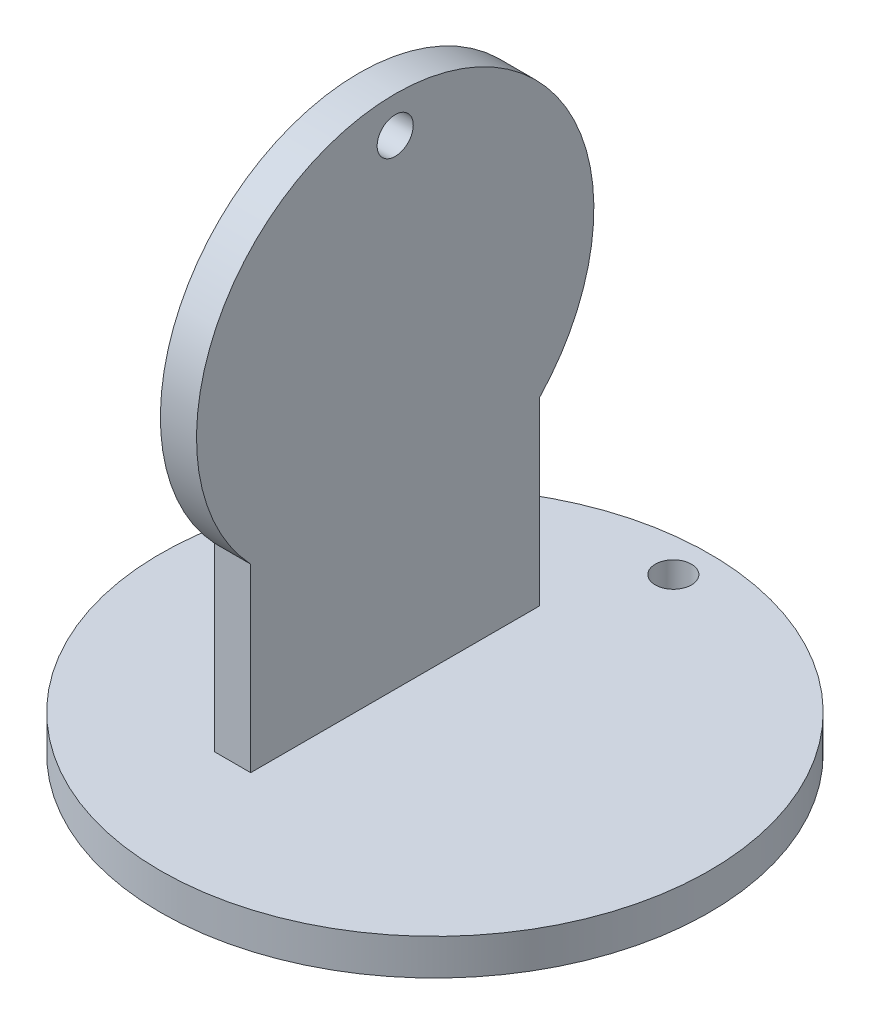
ISO-10303-21;
HEADER;
FILE_DESCRIPTION(('STEP AP214'),'2;1');
FILE_NAME('part.step','',(''),(''),'','','');
FILE_SCHEMA(('AUTOMOTIVE_DESIGN { 1 0 10303 214 1 1 1 1 }'));
ENDSEC;
DATA;
#1=APPLICATION_CONTEXT('core data for automotive mechanical design processes');
#2=APPLICATION_PROTOCOL_DEFINITION('international standard','automotive_design',2000,#1);
#3=PRODUCT_CONTEXT('',#1,'mechanical');
#4=PRODUCT('Part','Part','',(#3));
#5=PRODUCT_RELATED_PRODUCT_CATEGORY('part','',(#4));
#6=PRODUCT_DEFINITION_FORMATION('','',#4);
#7=PRODUCT_DEFINITION_CONTEXT('part definition',#1,'design');
#8=PRODUCT_DEFINITION('design','',#6,#7);
#9=PRODUCT_DEFINITION_SHAPE('','',#8);
#10=(LENGTH_UNIT() NAMED_UNIT(*) SI_UNIT(.MILLI.,.METRE.));
#11=(NAMED_UNIT(*) PLANE_ANGLE_UNIT() SI_UNIT($,.RADIAN.));
#12=(NAMED_UNIT(*) SI_UNIT($,.STERADIAN.) SOLID_ANGLE_UNIT());
#13=UNCERTAINTY_MEASURE_WITH_UNIT(LENGTH_MEASURE(1.E-05),#10,'distance_accuracy_value','');
#14=(GEOMETRIC_REPRESENTATION_CONTEXT(3) GLOBAL_UNCERTAINTY_ASSIGNED_CONTEXT((#13)) GLOBAL_UNIT_ASSIGNED_CONTEXT((#10,
#11,#12)) REPRESENTATION_CONTEXT('',''));
#15=CARTESIAN_POINT('',(0.,0.,0.));
#16=DIRECTION('',(0.,0.,1.));
#17=DIRECTION('',(1.,0.,0.));
#18=AXIS2_PLACEMENT_3D('',#15,#16,#17);
#19=CARTESIAN_POINT('',(0.,5.,0.));
#20=DIRECTION('',(0.,1.,0.));
#21=DIRECTION('',(0.,0.,1.));
#22=AXIS2_PLACEMENT_3D('',#19,#20,#21);
#23=PLANE('',#22);
#24=CARTESIAN_POINT('',(0.,5.,0.));
#25=DIRECTION('',(0.,1.,0.));
#26=DIRECTION('',(0.,0.,1.));
#27=AXIS2_PLACEMENT_3D('',#24,#25,#26);
#28=CIRCLE('',#27,38.);
#29=CARTESIAN_POINT('',(0.,5.,38.));
#30=VERTEX_POINT('',#29);
#31=EDGE_CURVE('E11',#30,#30,#28,.T.);
#32=ORIENTED_EDGE('',*,*,#31,.T.);
#33=EDGE_LOOP('',(#32));
#34=FACE_BOUND('',#33,.T.);
#35=CARTESIAN_POINT('',(0.,5.,-33.));
#36=DIRECTION('',(0.,1.,0.));
#37=DIRECTION('',(0.,0.,1.));
#38=AXIS2_PLACEMENT_3D('',#35,#36,#37);
#39=CIRCLE('',#38,2.5);
#40=CARTESIAN_POINT('',(0.,5.,-30.5));
#41=VERTEX_POINT('',#40);
#42=EDGE_CURVE('E120',#41,#41,#39,.T.);
#43=ORIENTED_EDGE('',*,*,#42,.F.);
#44=EDGE_LOOP('',(#43));
#45=FACE_BOUND('',#44,.T.);
#46=DIRECTION('',(0.,0.,-1.));
#47=VECTOR('',#46,1.);
#48=CARTESIAN_POINT('',(-10.5,4.99999999999999,20.));
#49=LINE('',#48,#47);
#50=CARTESIAN_POINT('',(-10.5,5.,20.));
#51=VERTEX_POINT('',#50);
#52=CARTESIAN_POINT('',(-10.5,4.99999999999999,-20.));
#53=VERTEX_POINT('',#52);
#54=EDGE_CURVE('E53',#51,#53,#49,.T.);
#55=ORIENTED_EDGE('',*,*,#54,.T.);
#56=DIRECTION('',(-1.,0.,0.));
#57=VECTOR('',#56,1.);
#58=CARTESIAN_POINT('',(-5.5,4.99999999999999,-20.));
#59=LINE('',#58,#57);
#60=CARTESIAN_POINT('',(-5.5,4.99999999999999,-20.));
#61=VERTEX_POINT('',#60);
#62=EDGE_CURVE('E79',#61,#53,#59,.T.);
#63=ORIENTED_EDGE('',*,*,#62,.F.);
#64=DIRECTION('',(0.,0.,-1.));
#65=VECTOR('',#64,1.);
#66=CARTESIAN_POINT('',(-5.5,4.99999999999999,20.));
#67=LINE('',#66,#65);
#68=CARTESIAN_POINT('',(-5.5,4.99999999999999,20.));
#69=VERTEX_POINT('',#68);
#70=EDGE_CURVE('E62',#69,#61,#67,.T.);
#71=ORIENTED_EDGE('',*,*,#70,.F.);
#72=DIRECTION('',(-1.,0.,0.));
#73=VECTOR('',#72,1.);
#74=CARTESIAN_POINT('',(-5.5,4.99999999999999,20.));
#75=LINE('',#74,#73);
#76=EDGE_CURVE('E101',#69,#51,#75,.T.);
#77=ORIENTED_EDGE('',*,*,#76,.T.);
#78=EDGE_LOOP('',(#55,#63,#71,#77));
#79=FACE_BOUND('',#78,.T.);
#80=ADVANCED_FACE('F38',(#34,#45,#79),#23,.T.);
#81=CARTESIAN_POINT('',(0.,0.,0.));
#82=DIRECTION('',(0.,1.,0.));
#83=DIRECTION('',(0.,0.,1.));
#84=AXIS2_PLACEMENT_3D('',#81,#82,#83);
#85=PLANE('',#84);
#86=CARTESIAN_POINT('',(0.,0.,0.));
#87=DIRECTION('',(0.,1.,0.));
#88=DIRECTION('',(0.,0.,1.));
#89=AXIS2_PLACEMENT_3D('',#86,#87,#88);
#90=CIRCLE('',#89,38.);
#91=CARTESIAN_POINT('',(0.,0.,38.));
#92=VERTEX_POINT('',#91);
#93=EDGE_CURVE('E42',#92,#92,#90,.T.);
#94=ORIENTED_EDGE('',*,*,#93,.F.);
#95=EDGE_LOOP('',(#94));
#96=FACE_BOUND('',#95,.T.);
#97=CARTESIAN_POINT('',(0.,0.,-33.));
#98=DIRECTION('',(0.,1.,0.));
#99=DIRECTION('',(0.,0.,1.));
#100=AXIS2_PLACEMENT_3D('',#97,#98,#99);
#101=CIRCLE('',#100,2.5);
#102=CARTESIAN_POINT('',(0.,0.,-30.5));
#103=VERTEX_POINT('',#102);
#104=EDGE_CURVE('E119',#103,#103,#101,.T.);
#105=ORIENTED_EDGE('',*,*,#104,.T.);
#106=EDGE_LOOP('',(#105));
#107=FACE_BOUND('',#106,.T.);
#108=ADVANCED_FACE('F126',(#96,#107),#85,.F.);
#109=CARTESIAN_POINT('',(0.,5.,0.));
#110=DIRECTION('',(0.,-1.,0.));
#111=DIRECTION('',(0.,0.,-1.));
#112=AXIS2_PLACEMENT_3D('',#109,#110,#111);
#113=CYLINDRICAL_SURFACE('',#112,38.);
#114=ORIENTED_EDGE('',*,*,#31,.F.);
#115=EDGE_LOOP('',(#114));
#116=FACE_BOUND('',#115,.T.);
#117=ORIENTED_EDGE('',*,*,#93,.T.);
#118=EDGE_LOOP('',(#117));
#119=FACE_BOUND('',#118,.T.);
#120=ADVANCED_FACE('F40',(#116,#119),#113,.T.);
#121=CARTESIAN_POINT('',(0.,5.,-33.));
#122=DIRECTION('',(0.,-1.,0.));
#123=DIRECTION('',(0.,0.,-1.));
#124=AXIS2_PLACEMENT_3D('',#121,#122,#123);
#125=CYLINDRICAL_SURFACE('',#124,2.5);
#126=ORIENTED_EDGE('',*,*,#42,.T.);
#127=EDGE_LOOP('',(#126));
#128=FACE_BOUND('',#127,.T.);
#129=ORIENTED_EDGE('',*,*,#104,.F.);
#130=EDGE_LOOP('',(#129));
#131=FACE_BOUND('',#130,.T.);
#132=ADVANCED_FACE('F128',(#128,#131),#125,.F.);
#133=CARTESIAN_POINT('',(-5.5,48.8745860881769,0.));
#134=DIRECTION('',(1.,0.,0.));
#135=DIRECTION('',(0.,0.,-1.));
#136=AXIS2_PLACEMENT_3D('',#133,#134,#135);
#137=PLANE('',#136);
#138=DIRECTION('',(0.,1.,0.));
#139=VECTOR('',#138,1.);
#140=CARTESIAN_POINT('',(-5.5,30.,-20.));
#141=LINE('',#140,#139);
#142=CARTESIAN_POINT('',(-5.5,30.,-20.));
#143=VERTEX_POINT('',#142);
#144=EDGE_CURVE('E92',#61,#143,#141,.T.);
#145=ORIENTED_EDGE('',*,*,#144,.T.);
#146=CARTESIAN_POINT('',(-5.5,48.8745860881769,0.));
#147=DIRECTION('',(1.,0.,0.));
#148=DIRECTION('',(0.,0.,-1.));
#149=AXIS2_PLACEMENT_3D('',#146,#147,#148);
#150=CIRCLE('',#149,27.5);
#151=CARTESIAN_POINT('',(-5.5,30.,20.));
#152=VERTEX_POINT('',#151);
#153=EDGE_CURVE('E86',#143,#152,#150,.T.);
#154=ORIENTED_EDGE('',*,*,#153,.T.);
#155=DIRECTION('',(0.,-1.,0.));
#156=VECTOR('',#155,1.);
#157=CARTESIAN_POINT('',(-5.5,30.,20.));
#158=LINE('',#157,#156);
#159=EDGE_CURVE('E90',#152,#69,#158,.T.);
#160=ORIENTED_EDGE('',*,*,#159,.T.);
#161=ORIENTED_EDGE('',*,*,#70,.T.);
#162=EDGE_LOOP('',(#145,#154,#160,#161));
#163=FACE_BOUND('',#162,.T.);
#164=CARTESIAN_POINT('',(-5.5,71.3745860881769,0.));
#165=DIRECTION('',(1.,0.,0.));
#166=DIRECTION('',(0.,0.,-1.));
#167=AXIS2_PLACEMENT_3D('',#164,#165,#166);
#168=CIRCLE('',#167,2.5);
#169=CARTESIAN_POINT('',(-5.5,71.3745860881769,-2.5));
#170=VERTEX_POINT('',#169);
#171=EDGE_CURVE('E111',#170,#170,#168,.T.);
#172=ORIENTED_EDGE('',*,*,#171,.F.);
#173=EDGE_LOOP('',(#172));
#174=FACE_BOUND('',#173,.T.);
#175=ADVANCED_FACE('F87',(#163,#174),#137,.T.);
#176=CARTESIAN_POINT('',(-10.5,48.8745860881769,0.));
#177=DIRECTION('',(1.,0.,0.));
#178=DIRECTION('',(0.,0.,-1.));
#179=AXIS2_PLACEMENT_3D('',#176,#177,#178);
#180=PLANE('',#179);
#181=DIRECTION('',(0.,1.,0.));
#182=VECTOR('',#181,1.);
#183=CARTESIAN_POINT('',(-10.5,30.,-20.));
#184=LINE('',#183,#182);
#185=CARTESIAN_POINT('',(-10.5,30.,-20.));
#186=VERTEX_POINT('',#185);
#187=EDGE_CURVE('E109',#53,#186,#184,.T.);
#188=ORIENTED_EDGE('',*,*,#187,.F.);
#189=ORIENTED_EDGE('',*,*,#54,.F.);
#190=DIRECTION('',(0.,-1.,0.));
#191=VECTOR('',#190,1.);
#192=CARTESIAN_POINT('',(-10.5,30.,20.));
#193=LINE('',#192,#191);
#194=CARTESIAN_POINT('',(-10.5,30.,20.));
#195=VERTEX_POINT('',#194);
#196=EDGE_CURVE('E113',#195,#51,#193,.T.);
#197=ORIENTED_EDGE('',*,*,#196,.F.);
#198=CARTESIAN_POINT('',(-10.5,48.8745860881769,0.));
#199=DIRECTION('',(1.,0.,0.));
#200=DIRECTION('',(0.,0.,-1.));
#201=AXIS2_PLACEMENT_3D('',#198,#199,#200);
#202=CIRCLE('',#201,27.5);
#203=EDGE_CURVE('E98',#186,#195,#202,.T.);
#204=ORIENTED_EDGE('',*,*,#203,.F.);
#205=EDGE_LOOP('',(#188,#189,#197,#204));
#206=FACE_BOUND('',#205,.T.);
#207=CARTESIAN_POINT('',(-10.5,71.3745860881769,0.));
#208=DIRECTION('',(1.,0.,0.));
#209=DIRECTION('',(0.,0.,-1.));
#210=AXIS2_PLACEMENT_3D('',#207,#208,#209);
#211=CIRCLE('',#210,2.5);
#212=CARTESIAN_POINT('',(-10.5,71.3745860881769,-2.5));
#213=VERTEX_POINT('',#212);
#214=EDGE_CURVE('E239',#213,#213,#211,.T.);
#215=ORIENTED_EDGE('',*,*,#214,.T.);
#216=EDGE_LOOP('',(#215));
#217=FACE_BOUND('',#216,.T.);
#218=ADVANCED_FACE('F136',(#206,#217),#180,.F.);
#219=CARTESIAN_POINT('',(-5.5,30.,-20.));
#220=DIRECTION('',(0.,0.,1.));
#221=DIRECTION('',(0.,-1.,0.));
#222=AXIS2_PLACEMENT_3D('',#219,#220,#221);
#223=PLANE('',#222);
#224=ORIENTED_EDGE('',*,*,#187,.T.);
#225=DIRECTION('',(-1.,0.,0.));
#226=VECTOR('',#225,1.);
#227=CARTESIAN_POINT('',(-5.5,30.,-20.));
#228=LINE('',#227,#226);
#229=EDGE_CURVE('E100',#143,#186,#228,.T.);
#230=ORIENTED_EDGE('',*,*,#229,.F.);
#231=ORIENTED_EDGE('',*,*,#144,.F.);
#232=ORIENTED_EDGE('',*,*,#62,.T.);
#233=EDGE_LOOP('',(#224,#230,#231,#232));
#234=FACE_BOUND('',#233,.T.);
#235=ADVANCED_FACE('F186',(#234),#223,.F.);
#236=CARTESIAN_POINT('',(-5.5,48.8745860881769,0.));
#237=DIRECTION('',(-1.,0.,0.));
#238=DIRECTION('',(0.,0.,1.));
#239=AXIS2_PLACEMENT_3D('',#236,#237,#238);
#240=CYLINDRICAL_SURFACE('',#239,27.5);
#241=ORIENTED_EDGE('',*,*,#203,.T.);
#242=DIRECTION('',(-1.,0.,0.));
#243=VECTOR('',#242,1.);
#244=CARTESIAN_POINT('',(-5.5,30.,20.));
#245=LINE('',#244,#243);
#246=EDGE_CURVE('E96',#152,#195,#245,.T.);
#247=ORIENTED_EDGE('',*,*,#246,.F.);
#248=ORIENTED_EDGE('',*,*,#153,.F.);
#249=ORIENTED_EDGE('',*,*,#229,.T.);
#250=EDGE_LOOP('',(#241,#247,#248,#249));
#251=FACE_BOUND('',#250,.T.);
#252=ADVANCED_FACE('F97',(#251),#240,.T.);
#253=CARTESIAN_POINT('',(-5.5,30.,20.));
#254=DIRECTION('',(0.,0.,-1.));
#255=DIRECTION('',(-1.,0.,0.));
#256=AXIS2_PLACEMENT_3D('',#253,#254,#255);
#257=PLANE('',#256);
#258=ORIENTED_EDGE('',*,*,#196,.T.);
#259=ORIENTED_EDGE('',*,*,#76,.F.);
#260=ORIENTED_EDGE('',*,*,#159,.F.);
#261=ORIENTED_EDGE('',*,*,#246,.T.);
#262=EDGE_LOOP('',(#258,#259,#260,#261));
#263=FACE_BOUND('',#262,.T.);
#264=ADVANCED_FACE('F103',(#263),#257,.F.);
#265=CARTESIAN_POINT('',(-5.5,71.3745860881769,0.));
#266=DIRECTION('',(-1.,0.,0.));
#267=DIRECTION('',(0.,0.,1.));
#268=AXIS2_PLACEMENT_3D('',#265,#266,#267);
#269=CYLINDRICAL_SURFACE('',#268,2.5);
#270=ORIENTED_EDGE('',*,*,#171,.T.);
#271=EDGE_LOOP('',(#270));
#272=FACE_BOUND('',#271,.T.);
#273=ORIENTED_EDGE('',*,*,#214,.F.);
#274=EDGE_LOOP('',(#273));
#275=FACE_BOUND('',#274,.T.);
#276=ADVANCED_FACE('F213',(#272,#275),#269,.F.);
#277=CLOSED_SHELL('',(#80,#108,#120,#132,#175,#218,#235,#252,#264,#276));
#278=MANIFOLD_SOLID_BREP('B2',#277);
#279=ADVANCED_BREP_SHAPE_REPRESENTATION('',(#18,#278),#14);
#280=SHAPE_DEFINITION_REPRESENTATION(#9,#279);
ENDSEC;
END-ISO-10303-21;
